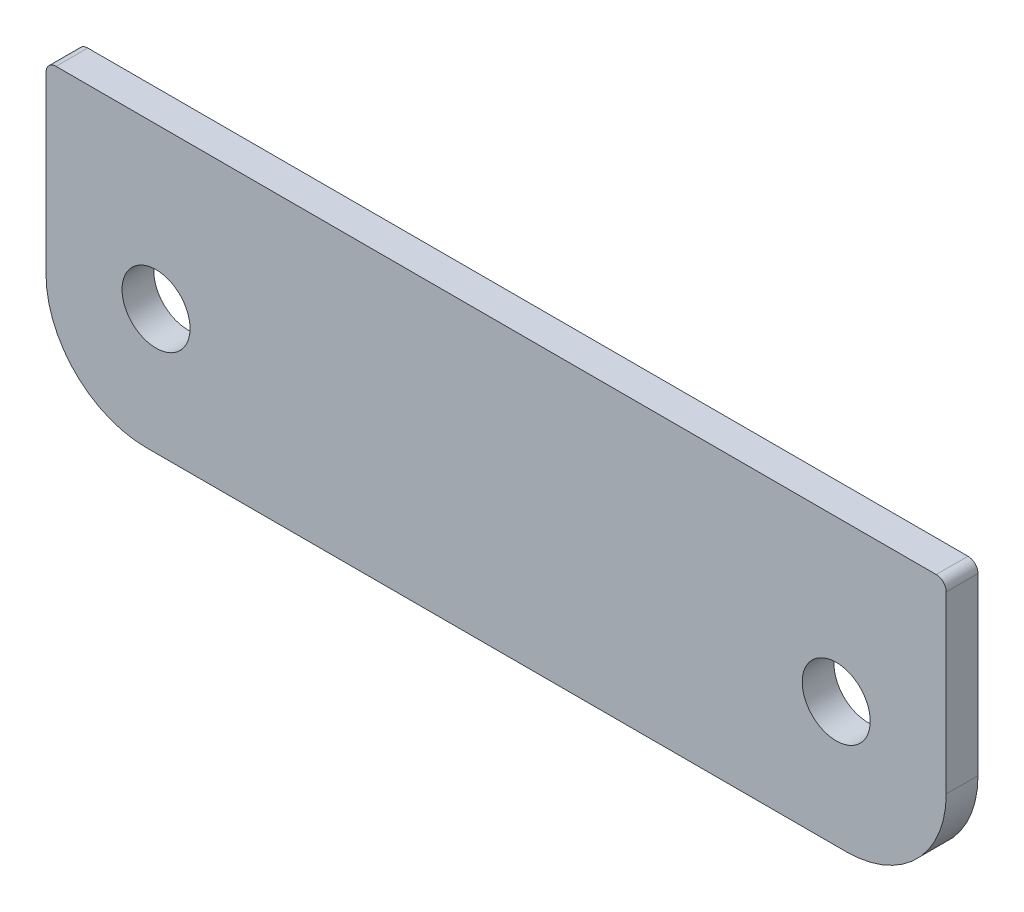
ISO-10303-21;
HEADER;
FILE_DESCRIPTION(('STEP AP214'),'2;1');
FILE_NAME('part.step','',(''),(''),'','','');
FILE_SCHEMA(('AUTOMOTIVE_DESIGN { 1 0 10303 214 1 1 1 1 }'));
ENDSEC;
DATA;
#1=APPLICATION_CONTEXT('core data for automotive mechanical design processes');
#2=APPLICATION_PROTOCOL_DEFINITION('international standard','automotive_design',2000,#1);
#3=PRODUCT_CONTEXT('',#1,'mechanical');
#4=PRODUCT('Part','Part','',(#3));
#5=PRODUCT_RELATED_PRODUCT_CATEGORY('part','',(#4));
#6=PRODUCT_DEFINITION_FORMATION('','',#4);
#7=PRODUCT_DEFINITION_CONTEXT('part definition',#1,'design');
#8=PRODUCT_DEFINITION('design','',#6,#7);
#9=PRODUCT_DEFINITION_SHAPE('','',#8);
#10=(LENGTH_UNIT() NAMED_UNIT(*) SI_UNIT(.MILLI.,.METRE.));
#11=(NAMED_UNIT(*) PLANE_ANGLE_UNIT() SI_UNIT($,.RADIAN.));
#12=(NAMED_UNIT(*) SI_UNIT($,.STERADIAN.) SOLID_ANGLE_UNIT());
#13=UNCERTAINTY_MEASURE_WITH_UNIT(LENGTH_MEASURE(1.E-05),#10,'distance_accuracy_value','');
#14=(GEOMETRIC_REPRESENTATION_CONTEXT(3) GLOBAL_UNCERTAINTY_ASSIGNED_CONTEXT((#13)) GLOBAL_UNIT_ASSIGNED_CONTEXT((#10,
#11,#12)) REPRESENTATION_CONTEXT('',''));
#15=CARTESIAN_POINT('',(0.,0.,0.));
#16=DIRECTION('',(0.,0.,1.));
#17=DIRECTION('',(1.,0.,0.));
#18=AXIS2_PLACEMENT_3D('',#15,#16,#17);
#19=CARTESIAN_POINT('',(0.,0.,1.5875));
#20=DIRECTION('',(0.,0.,1.));
#21=DIRECTION('',(1.,0.,0.));
#22=AXIS2_PLACEMENT_3D('',#19,#20,#21);
#23=PLANE('',#22);
#24=CARTESIAN_POINT('',(34.,0.,1.5875));
#25=DIRECTION('',(0.,0.,1.));
#26=DIRECTION('',(1.,0.,0.));
#27=AXIS2_PLACEMENT_3D('',#24,#25,#26);
#28=CIRCLE('',#27,3.4);
#29=CARTESIAN_POINT('',(37.4,0.,1.5875));
#30=VERTEX_POINT('',#29);
#31=EDGE_CURVE('E130',#30,#30,#28,.T.);
#32=ORIENTED_EDGE('',*,*,#31,.F.);
#33=EDGE_LOOP('',(#32));
#34=FACE_BOUND('',#33,.T.);
#35=DIRECTION('',(0.,1.,0.));
#36=VECTOR('',#35,1.);
#37=CARTESIAN_POINT('',(45.,12.499999995,1.5875));
#38=LINE('',#37,#36);
#39=CARTESIAN_POINT('',(45.,-2.499999995,1.5875));
#40=VERTEX_POINT('',#39);
#41=CARTESIAN_POINT('',(45.,14.999999995,1.5875));
#42=VERTEX_POINT('',#41);
#43=EDGE_CURVE('E122',#40,#42,#38,.T.);
#44=ORIENTED_EDGE('',*,*,#43,.T.);
#45=CARTESIAN_POINT('',(44.,14.999999995,1.5875));
#46=DIRECTION('',(0.,0.,1.));
#47=DIRECTION('',(1.,0.,0.));
#48=AXIS2_PLACEMENT_3D('',#45,#46,#47);
#49=CIRCLE('',#48,1.);
#50=CARTESIAN_POINT('',(44.,15.999999995,1.5875));
#51=VERTEX_POINT('',#50);
#52=EDGE_CURVE('E47',#42,#51,#49,.T.);
#53=ORIENTED_EDGE('',*,*,#52,.T.);
#54=DIRECTION('',(-1.,0.,0.));
#55=VECTOR('',#54,1.);
#56=CARTESIAN_POINT('',(-45.,15.999999995,1.5875));
#57=LINE('',#56,#55);
#58=CARTESIAN_POINT('',(-44.,15.999999995,1.5875));
#59=VERTEX_POINT('',#58);
#60=EDGE_CURVE('E168',#51,#59,#57,.T.);
#61=ORIENTED_EDGE('',*,*,#60,.T.);
#62=CARTESIAN_POINT('',(-44.,14.999999995,1.5875));
#63=DIRECTION('',(0.,0.,1.));
#64=DIRECTION('',(1.,0.,0.));
#65=AXIS2_PLACEMENT_3D('',#62,#63,#64);
#66=CIRCLE('',#65,1.);
#67=CARTESIAN_POINT('',(-45.,14.999999995,1.5875));
#68=VERTEX_POINT('',#67);
#69=EDGE_CURVE('E54',#59,#68,#66,.T.);
#70=ORIENTED_EDGE('',*,*,#69,.T.);
#71=DIRECTION('',(0.,-1.,0.));
#72=VECTOR('',#71,1.);
#73=CARTESIAN_POINT('',(-45.,12.499999995,1.5875));
#74=LINE('',#73,#72);
#75=CARTESIAN_POINT('',(-45.,-2.499999995,1.5875));
#76=VERTEX_POINT('',#75);
#77=EDGE_CURVE('E174',#68,#76,#74,.T.);
#78=ORIENTED_EDGE('',*,*,#77,.T.);
#79=CARTESIAN_POINT('',(-35.,-2.499999995,1.5875));
#80=DIRECTION('',(0.,0.,1.));
#81=DIRECTION('',(1.,0.,0.));
#82=AXIS2_PLACEMENT_3D('',#79,#80,#81);
#83=CIRCLE('',#82,10.);
#84=CARTESIAN_POINT('',(-35.,-12.499999995,1.5875));
#85=VERTEX_POINT('',#84);
#86=EDGE_CURVE('E149',#76,#85,#83,.T.);
#87=ORIENTED_EDGE('',*,*,#86,.T.);
#88=DIRECTION('',(1.,0.,0.));
#89=VECTOR('',#88,1.);
#90=CARTESIAN_POINT('',(-45.,-12.499999995,1.5875));
#91=LINE('',#90,#89);
#92=CARTESIAN_POINT('',(35.,-12.499999995,1.5875));
#93=VERTEX_POINT('',#92);
#94=EDGE_CURVE('E123',#85,#93,#91,.T.);
#95=ORIENTED_EDGE('',*,*,#94,.T.);
#96=CARTESIAN_POINT('',(35.,-2.499999995,1.5875));
#97=DIRECTION('',(0.,0.,1.));
#98=DIRECTION('',(1.,0.,0.));
#99=AXIS2_PLACEMENT_3D('',#96,#97,#98);
#100=CIRCLE('',#99,10.);
#101=EDGE_CURVE('E151',#93,#40,#100,.T.);
#102=ORIENTED_EDGE('',*,*,#101,.T.);
#103=EDGE_LOOP('',(#44,#53,#61,#70,#78,#87,#95,#102));
#104=FACE_BOUND('',#103,.T.);
#105=CARTESIAN_POINT('',(-34.,0.,1.5875));
#106=DIRECTION('',(0.,0.,1.));
#107=DIRECTION('',(1.,0.,0.));
#108=AXIS2_PLACEMENT_3D('',#105,#106,#107);
#109=CIRCLE('',#108,3.4);
#110=CARTESIAN_POINT('',(-30.6,0.,1.5875));
#111=VERTEX_POINT('',#110);
#112=EDGE_CURVE('E223',#111,#111,#109,.T.);
#113=ORIENTED_EDGE('',*,*,#112,.F.);
#114=EDGE_LOOP('',(#113));
#115=FACE_BOUND('',#114,.T.);
#116=ADVANCED_FACE('F39',(#34,#104,#115),#23,.T.);
#117=CARTESIAN_POINT('',(0.,0.,-1.5875));
#118=DIRECTION('',(0.,0.,1.));
#119=DIRECTION('',(1.,0.,0.));
#120=AXIS2_PLACEMENT_3D('',#117,#118,#119);
#121=PLANE('',#120);
#122=DIRECTION('',(-1.,0.,0.));
#123=VECTOR('',#122,1.);
#124=CARTESIAN_POINT('',(-45.,15.999999995,-1.5875));
#125=LINE('',#124,#123);
#126=CARTESIAN_POINT('',(44.,15.999999995,-1.5875));
#127=VERTEX_POINT('',#126);
#128=CARTESIAN_POINT('',(-44.,15.999999995,-1.5875));
#129=VERTEX_POINT('',#128);
#130=EDGE_CURVE('E129',#127,#129,#125,.T.);
#131=ORIENTED_EDGE('',*,*,#130,.F.);
#132=CARTESIAN_POINT('',(44.,14.999999995,-1.5875));
#133=DIRECTION('',(0.,0.,1.));
#134=DIRECTION('',(1.,0.,0.));
#135=AXIS2_PLACEMENT_3D('',#132,#133,#134);
#136=CIRCLE('',#135,1.);
#137=CARTESIAN_POINT('',(45.,14.999999995,-1.5875));
#138=VERTEX_POINT('',#137);
#139=EDGE_CURVE('E128',#127,#138,#136,.F.);
#140=ORIENTED_EDGE('',*,*,#139,.T.);
#141=DIRECTION('',(0.,1.,0.));
#142=VECTOR('',#141,1.);
#143=CARTESIAN_POINT('',(45.,15.999999995,-1.5875));
#144=LINE('',#143,#142);
#145=CARTESIAN_POINT('',(45.,-2.49999999499999,-1.5875));
#146=VERTEX_POINT('',#145);
#147=EDGE_CURVE('E121',#146,#138,#144,.T.);
#148=ORIENTED_EDGE('',*,*,#147,.F.);
#149=CARTESIAN_POINT('',(35.,-2.499999995,-1.5875));
#150=DIRECTION('',(0.,0.,1.));
#151=DIRECTION('',(1.,0.,0.));
#152=AXIS2_PLACEMENT_3D('',#149,#150,#151);
#153=CIRCLE('',#152,10.);
#154=CARTESIAN_POINT('',(35.,-12.499999995,-1.5875));
#155=VERTEX_POINT('',#154);
#156=EDGE_CURVE('E107',#146,#155,#153,.F.);
#157=ORIENTED_EDGE('',*,*,#156,.T.);
#158=DIRECTION('',(1.,0.,0.));
#159=VECTOR('',#158,1.);
#160=CARTESIAN_POINT('',(-45.,-12.499999995,-1.5875));
#161=LINE('',#160,#159);
#162=CARTESIAN_POINT('',(-35.,-12.499999995,-1.5875));
#163=VERTEX_POINT('',#162);
#164=EDGE_CURVE('E142',#163,#155,#161,.T.);
#165=ORIENTED_EDGE('',*,*,#164,.F.);
#166=CARTESIAN_POINT('',(-35.,-2.499999995,-1.5875));
#167=DIRECTION('',(0.,0.,1.));
#168=DIRECTION('',(1.,0.,0.));
#169=AXIS2_PLACEMENT_3D('',#166,#167,#168);
#170=CIRCLE('',#169,10.);
#171=CARTESIAN_POINT('',(-45.,-2.499999995,-1.5875));
#172=VERTEX_POINT('',#171);
#173=EDGE_CURVE('E118',#163,#172,#170,.F.);
#174=ORIENTED_EDGE('',*,*,#173,.T.);
#175=DIRECTION('',(0.,-1.,0.));
#176=VECTOR('',#175,1.);
#177=CARTESIAN_POINT('',(-45.,12.499999995,-1.5875));
#178=LINE('',#177,#176);
#179=CARTESIAN_POINT('',(-45.,14.999999995,-1.5875));
#180=VERTEX_POINT('',#179);
#181=EDGE_CURVE('E133',#180,#172,#178,.T.);
#182=ORIENTED_EDGE('',*,*,#181,.F.);
#183=CARTESIAN_POINT('',(-44.,14.999999995,-1.5875));
#184=DIRECTION('',(0.,0.,1.));
#185=DIRECTION('',(1.,0.,0.));
#186=AXIS2_PLACEMENT_3D('',#183,#184,#185);
#187=CIRCLE('',#186,1.);
#188=EDGE_CURVE('E161',#180,#129,#187,.F.);
#189=ORIENTED_EDGE('',*,*,#188,.T.);
#190=EDGE_LOOP('',(#131,#140,#148,#157,#165,#174,#182,#189));
#191=FACE_BOUND('',#190,.T.);
#192=CARTESIAN_POINT('',(34.,0.,-1.5875));
#193=DIRECTION('',(0.,0.,1.));
#194=DIRECTION('',(1.,0.,0.));
#195=AXIS2_PLACEMENT_3D('',#192,#193,#194);
#196=CIRCLE('',#195,3.4);
#197=CARTESIAN_POINT('',(37.4,0.,-1.5875));
#198=VERTEX_POINT('',#197);
#199=EDGE_CURVE('E136',#198,#198,#196,.T.);
#200=ORIENTED_EDGE('',*,*,#199,.T.);
#201=EDGE_LOOP('',(#200));
#202=FACE_BOUND('',#201,.T.);
#203=CARTESIAN_POINT('',(-34.,0.,-1.5875));
#204=DIRECTION('',(0.,0.,1.));
#205=DIRECTION('',(1.,0.,0.));
#206=AXIS2_PLACEMENT_3D('',#203,#204,#205);
#207=CIRCLE('',#206,3.4);
#208=CARTESIAN_POINT('',(-30.6,0.,-1.5875));
#209=VERTEX_POINT('',#208);
#210=EDGE_CURVE('E226',#209,#209,#207,.T.);
#211=ORIENTED_EDGE('',*,*,#210,.T.);
#212=EDGE_LOOP('',(#211));
#213=FACE_BOUND('',#212,.T.);
#214=ADVANCED_FACE('F126',(#191,#202,#213),#121,.F.);
#215=CARTESIAN_POINT('',(45.,15.999999995,1.5875));
#216=DIRECTION('',(-1.,0.,0.));
#217=DIRECTION('',(0.,0.,1.));
#218=AXIS2_PLACEMENT_3D('',#215,#216,#217);
#219=PLANE('',#218);
#220=ORIENTED_EDGE('',*,*,#147,.T.);
#221=DIRECTION('',(0.,0.,-1.));
#222=VECTOR('',#221,1.);
#223=CARTESIAN_POINT('',(45.,14.999999995,1.5875));
#224=LINE('',#223,#222);
#225=EDGE_CURVE('E62',#138,#42,#224,.F.);
#226=ORIENTED_EDGE('',*,*,#225,.T.);
#227=ORIENTED_EDGE('',*,*,#43,.F.);
#228=DIRECTION('',(0.,0.,-1.));
#229=VECTOR('',#228,1.);
#230=CARTESIAN_POINT('',(45.,-2.499999995,1.5875));
#231=LINE('',#230,#229);
#232=EDGE_CURVE('E111',#40,#146,#231,.T.);
#233=ORIENTED_EDGE('',*,*,#232,.T.);
#234=EDGE_LOOP('',(#220,#226,#227,#233));
#235=FACE_BOUND('',#234,.T.);
#236=ADVANCED_FACE('F120',(#235),#219,.F.);
#237=CARTESIAN_POINT('',(-45.,15.999999995,1.5875));
#238=DIRECTION('',(0.,-1.,0.));
#239=DIRECTION('',(0.,0.,-1.));
#240=AXIS2_PLACEMENT_3D('',#237,#238,#239);
#241=PLANE('',#240);
#242=ORIENTED_EDGE('',*,*,#60,.F.);
#243=DIRECTION('',(0.,0.,-1.));
#244=VECTOR('',#243,1.);
#245=CARTESIAN_POINT('',(44.,15.999999995,1.5875));
#246=LINE('',#245,#244);
#247=EDGE_CURVE('E158',#51,#127,#246,.T.);
#248=ORIENTED_EDGE('',*,*,#247,.T.);
#249=ORIENTED_EDGE('',*,*,#130,.T.);
#250=DIRECTION('',(0.,0.,-1.));
#251=VECTOR('',#250,1.);
#252=CARTESIAN_POINT('',(-44.,15.999999995,1.5875));
#253=LINE('',#252,#251);
#254=EDGE_CURVE('E156',#129,#59,#253,.F.);
#255=ORIENTED_EDGE('',*,*,#254,.T.);
#256=EDGE_LOOP('',(#242,#248,#249,#255));
#257=FACE_BOUND('',#256,.T.);
#258=ADVANCED_FACE('F172',(#257),#241,.F.);
#259=CARTESIAN_POINT('',(-45.,12.499999995,1.5875));
#260=DIRECTION('',(1.,0.,0.));
#261=DIRECTION('',(0.,0.,-1.));
#262=AXIS2_PLACEMENT_3D('',#259,#260,#261);
#263=PLANE('',#262);
#264=ORIENTED_EDGE('',*,*,#77,.F.);
#265=DIRECTION('',(0.,0.,-1.));
#266=VECTOR('',#265,1.);
#267=CARTESIAN_POINT('',(-45.,14.999999995,1.5875));
#268=LINE('',#267,#266);
#269=EDGE_CURVE('E11',#68,#180,#268,.T.);
#270=ORIENTED_EDGE('',*,*,#269,.T.);
#271=ORIENTED_EDGE('',*,*,#181,.T.);
#272=DIRECTION('',(0.,0.,-1.));
#273=VECTOR('',#272,1.);
#274=CARTESIAN_POINT('',(-45.,-2.499999995,1.5875));
#275=LINE('',#274,#273);
#276=EDGE_CURVE('E153',#172,#76,#275,.F.);
#277=ORIENTED_EDGE('',*,*,#276,.T.);
#278=EDGE_LOOP('',(#264,#270,#271,#277));
#279=FACE_BOUND('',#278,.T.);
#280=ADVANCED_FACE('F202',(#279),#263,.F.);
#281=CARTESIAN_POINT('',(-45.,-12.499999995,1.5875));
#282=DIRECTION('',(0.,1.,0.));
#283=DIRECTION('',(0.,0.,1.));
#284=AXIS2_PLACEMENT_3D('',#281,#282,#283);
#285=PLANE('',#284);
#286=ORIENTED_EDGE('',*,*,#164,.T.);
#287=DIRECTION('',(0.,0.,-1.));
#288=VECTOR('',#287,1.);
#289=CARTESIAN_POINT('',(35.,-12.499999995,1.5875));
#290=LINE('',#289,#288);
#291=EDGE_CURVE('E112',#155,#93,#290,.F.);
#292=ORIENTED_EDGE('',*,*,#291,.T.);
#293=ORIENTED_EDGE('',*,*,#94,.F.);
#294=DIRECTION('',(0.,0.,-1.));
#295=VECTOR('',#294,1.);
#296=CARTESIAN_POINT('',(-35.,-12.499999995,1.5875));
#297=LINE('',#296,#295);
#298=EDGE_CURVE('E117',#85,#163,#297,.T.);
#299=ORIENTED_EDGE('',*,*,#298,.T.);
#300=EDGE_LOOP('',(#286,#292,#293,#299));
#301=FACE_BOUND('',#300,.T.);
#302=ADVANCED_FACE('F199',(#301),#285,.F.);
#303=CARTESIAN_POINT('',(34.,0.,1.5875));
#304=DIRECTION('',(0.,0.,-1.));
#305=DIRECTION('',(-1.,0.,0.));
#306=AXIS2_PLACEMENT_3D('',#303,#304,#305);
#307=CYLINDRICAL_SURFACE('',#306,3.4);
#308=ORIENTED_EDGE('',*,*,#31,.T.);
#309=EDGE_LOOP('',(#308));
#310=FACE_BOUND('',#309,.T.);
#311=ORIENTED_EDGE('',*,*,#199,.F.);
#312=EDGE_LOOP('',(#311));
#313=FACE_BOUND('',#312,.T.);
#314=ADVANCED_FACE('F196',(#310,#313),#307,.F.);
#315=CARTESIAN_POINT('',(-34.,0.,1.5875));
#316=DIRECTION('',(0.,0.,-1.));
#317=DIRECTION('',(-1.,0.,0.));
#318=AXIS2_PLACEMENT_3D('',#315,#316,#317);
#319=CYLINDRICAL_SURFACE('',#318,3.4);
#320=ORIENTED_EDGE('',*,*,#112,.T.);
#321=EDGE_LOOP('',(#320));
#322=FACE_BOUND('',#321,.T.);
#323=ORIENTED_EDGE('',*,*,#210,.F.);
#324=EDGE_LOOP('',(#323));
#325=FACE_BOUND('',#324,.T.);
#326=ADVANCED_FACE('F211',(#322,#325),#319,.F.);
#327=CARTESIAN_POINT('',(35.,-2.499999995,1.5875));
#328=DIRECTION('',(0.,0.,-1.));
#329=DIRECTION('',(-1.,0.,0.));
#330=AXIS2_PLACEMENT_3D('',#327,#328,#329);
#331=CYLINDRICAL_SURFACE('',#330,10.);
#332=ORIENTED_EDGE('',*,*,#101,.F.);
#333=ORIENTED_EDGE('',*,*,#291,.F.);
#334=ORIENTED_EDGE('',*,*,#156,.F.);
#335=ORIENTED_EDGE('',*,*,#232,.F.);
#336=EDGE_LOOP('',(#332,#333,#334,#335));
#337=FACE_BOUND('',#336,.T.);
#338=ADVANCED_FACE('F110',(#337),#331,.T.);
#339=CARTESIAN_POINT('',(-35.,-2.499999995,1.5875));
#340=DIRECTION('',(0.,0.,-1.));
#341=DIRECTION('',(-1.,0.,0.));
#342=AXIS2_PLACEMENT_3D('',#339,#340,#341);
#343=CYLINDRICAL_SURFACE('',#342,10.);
#344=ORIENTED_EDGE('',*,*,#86,.F.);
#345=ORIENTED_EDGE('',*,*,#276,.F.);
#346=ORIENTED_EDGE('',*,*,#173,.F.);
#347=ORIENTED_EDGE('',*,*,#298,.F.);
#348=EDGE_LOOP('',(#344,#345,#346,#347));
#349=FACE_BOUND('',#348,.T.);
#350=ADVANCED_FACE('F178',(#349),#343,.T.);
#351=CARTESIAN_POINT('',(44.,14.999999995,1.5875));
#352=DIRECTION('',(0.,0.,-1.));
#353=DIRECTION('',(-1.,0.,0.));
#354=AXIS2_PLACEMENT_3D('',#351,#352,#353);
#355=CYLINDRICAL_SURFACE('',#354,1.);
#356=ORIENTED_EDGE('',*,*,#52,.F.);
#357=ORIENTED_EDGE('',*,*,#225,.F.);
#358=ORIENTED_EDGE('',*,*,#139,.F.);
#359=ORIENTED_EDGE('',*,*,#247,.F.);
#360=EDGE_LOOP('',(#356,#357,#358,#359));
#361=FACE_BOUND('',#360,.T.);
#362=ADVANCED_FACE('F176',(#361),#355,.T.);
#363=CARTESIAN_POINT('',(-44.,14.999999995,1.5875));
#364=DIRECTION('',(0.,0.,-1.));
#365=DIRECTION('',(-1.,0.,0.));
#366=AXIS2_PLACEMENT_3D('',#363,#364,#365);
#367=CYLINDRICAL_SURFACE('',#366,1.);
#368=ORIENTED_EDGE('',*,*,#69,.F.);
#369=ORIENTED_EDGE('',*,*,#254,.F.);
#370=ORIENTED_EDGE('',*,*,#188,.F.);
#371=ORIENTED_EDGE('',*,*,#269,.F.);
#372=EDGE_LOOP('',(#368,#369,#370,#371));
#373=FACE_BOUND('',#372,.T.);
#374=ADVANCED_FACE('F41',(#373),#367,.T.);
#375=CLOSED_SHELL('',(#116,#214,#236,#258,#280,#302,#314,#326,#338,#350,#362,#374));
#376=MANIFOLD_SOLID_BREP('B2',#375);
#377=ADVANCED_BREP_SHAPE_REPRESENTATION('',(#18,#376),#14);
#378=SHAPE_DEFINITION_REPRESENTATION(#9,#377);
ENDSEC;
END-ISO-10303-21;
